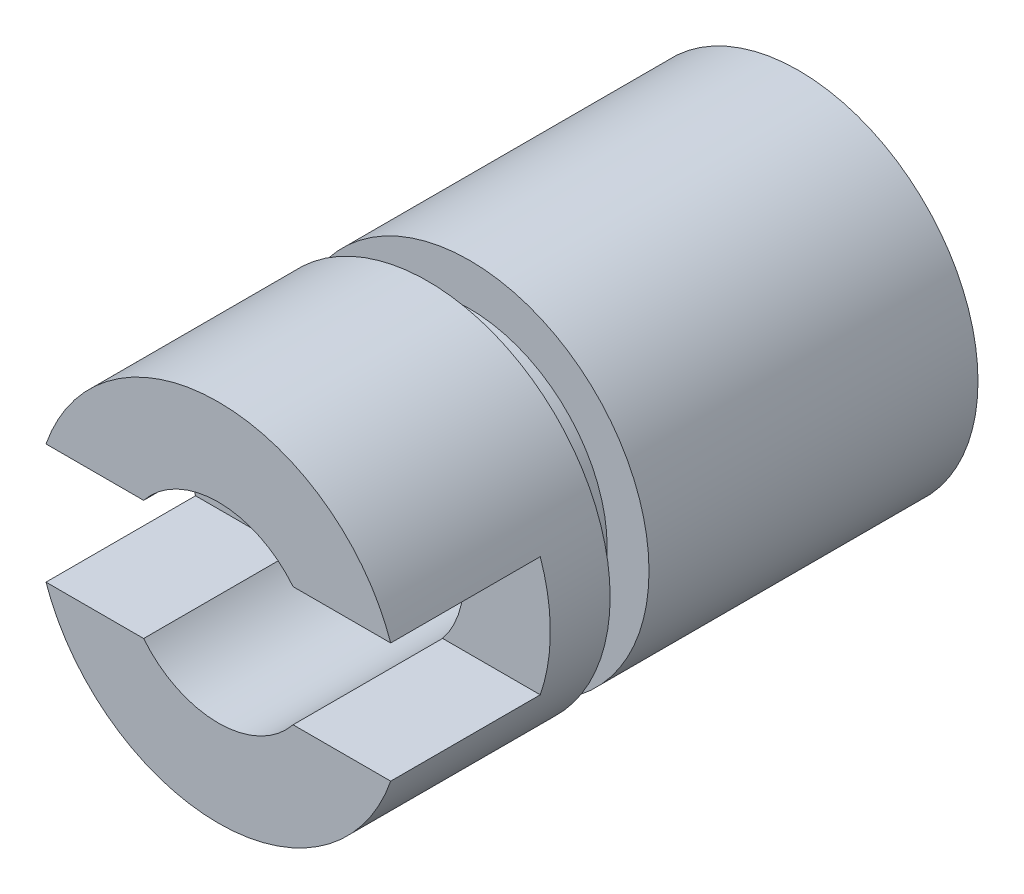
ISO-10303-21;
HEADER;
FILE_DESCRIPTION(('STEP AP214'),'2;1');
FILE_NAME('part.step','',(''),(''),'','','');
FILE_SCHEMA(('AUTOMOTIVE_DESIGN { 1 0 10303 214 1 1 1 1 }'));
ENDSEC;
DATA;
#1=APPLICATION_CONTEXT('core data for automotive mechanical design processes');
#2=APPLICATION_PROTOCOL_DEFINITION('international standard','automotive_design',2000,#1);
#3=PRODUCT_CONTEXT('',#1,'mechanical');
#4=PRODUCT('Part','Part','',(#3));
#5=PRODUCT_RELATED_PRODUCT_CATEGORY('part','',(#4));
#6=PRODUCT_DEFINITION_FORMATION('','',#4);
#7=PRODUCT_DEFINITION_CONTEXT('part definition',#1,'design');
#8=PRODUCT_DEFINITION('design','',#6,#7);
#9=PRODUCT_DEFINITION_SHAPE('','',#8);
#10=(LENGTH_UNIT() NAMED_UNIT(*) SI_UNIT(.MILLI.,.METRE.));
#11=(NAMED_UNIT(*) PLANE_ANGLE_UNIT() SI_UNIT($,.RADIAN.));
#12=(NAMED_UNIT(*) SI_UNIT($,.STERADIAN.) SOLID_ANGLE_UNIT());
#13=UNCERTAINTY_MEASURE_WITH_UNIT(LENGTH_MEASURE(1.E-05),#10,'distance_accuracy_value','');
#14=(GEOMETRIC_REPRESENTATION_CONTEXT(3) GLOBAL_UNCERTAINTY_ASSIGNED_CONTEXT((#13)) GLOBAL_UNIT_ASSIGNED_CONTEXT((#10,
#11,#12)) REPRESENTATION_CONTEXT('',''));
#15=CARTESIAN_POINT('',(0.,0.,0.));
#16=DIRECTION('',(0.,0.,1.));
#17=DIRECTION('',(1.,0.,0.));
#18=AXIS2_PLACEMENT_3D('',#15,#16,#17);
#19=CARTESIAN_POINT('',(0.,0.,9.7));
#20=DIRECTION('',(0.,0.,1.));
#21=DIRECTION('',(1.,0.,0.));
#22=AXIS2_PLACEMENT_3D('',#19,#20,#21);
#23=PLANE('',#22);
#24=DIRECTION('',(-1.,0.,0.));
#25=VECTOR('',#24,1.);
#26=CARTESIAN_POINT('',(0.,1.,9.7));
#27=LINE('',#26,#25);
#28=CARTESIAN_POINT('',(2.88140590684478,1.,9.7));
#29=VERTEX_POINT('',#28);
#30=CARTESIAN_POINT('',(1.24899959967968,1.,9.7));
#31=VERTEX_POINT('',#30);
#32=EDGE_CURVE('E152',#29,#31,#27,.T.);
#33=ORIENTED_EDGE('',*,*,#32,.F.);
#34=CARTESIAN_POINT('',(0.,0.,9.7));
#35=DIRECTION('',(0.,0.,1.));
#36=DIRECTION('',(1.,0.,0.));
#37=AXIS2_PLACEMENT_3D('',#34,#35,#36);
#38=CIRCLE('',#37,3.05);
#39=CARTESIAN_POINT('',(-2.88140590684478,1.,9.7));
#40=VERTEX_POINT('',#39);
#41=EDGE_CURVE('E134',#29,#40,#38,.T.);
#42=ORIENTED_EDGE('',*,*,#41,.T.);
#43=CARTESIAN_POINT('',(-1.24899959967968,1.,9.7));
#44=VERTEX_POINT('',#43);
#45=EDGE_CURVE('E113',#44,#40,#27,.T.);
#46=ORIENTED_EDGE('',*,*,#45,.F.);
#47=CARTESIAN_POINT('',(0.,0.,9.7));
#48=DIRECTION('',(0.,0.,1.));
#49=DIRECTION('',(1.,0.,0.));
#50=AXIS2_PLACEMENT_3D('',#47,#48,#49);
#51=CIRCLE('',#50,1.6);
#52=EDGE_CURVE('E128',#44,#31,#51,.F.);
#53=ORIENTED_EDGE('',*,*,#52,.T.);
#54=EDGE_LOOP('',(#33,#42,#46,#53));
#55=FACE_BOUND('',#54,.T.);
#56=ADVANCED_FACE('F41',(#55),#23,.T.);
#57=CARTESIAN_POINT('',(0.,0.,5.5));
#58=DIRECTION('',(0.,0.,1.));
#59=DIRECTION('',(1.,0.,0.));
#60=AXIS2_PLACEMENT_3D('',#57,#58,#59);
#61=PLANE('',#60);
#62=CARTESIAN_POINT('',(0.,0.,5.5));
#63=DIRECTION('',(0.,0.,1.));
#64=DIRECTION('',(1.,0.,0.));
#65=AXIS2_PLACEMENT_3D('',#62,#63,#64);
#66=CIRCLE('',#65,3.);
#67=CARTESIAN_POINT('',(3.,0.,5.5));
#68=VERTEX_POINT('',#67);
#69=EDGE_CURVE('E148',#68,#68,#66,.T.);
#70=ORIENTED_EDGE('',*,*,#69,.T.);
#71=EDGE_LOOP('',(#70));
#72=FACE_BOUND('',#71,.T.);
#73=CARTESIAN_POINT('',(0.,0.,5.5));
#74=DIRECTION('',(0.,0.,1.));
#75=DIRECTION('',(1.,0.,0.));
#76=AXIS2_PLACEMENT_3D('',#73,#74,#75);
#77=CIRCLE('',#76,2.3);
#78=CARTESIAN_POINT('',(2.3,0.,5.5));
#79=VERTEX_POINT('',#78);
#80=EDGE_CURVE('E127',#79,#79,#77,.T.);
#81=ORIENTED_EDGE('',*,*,#80,.F.);
#82=EDGE_LOOP('',(#81));
#83=FACE_BOUND('',#82,.T.);
#84=ADVANCED_FACE('F209',(#72,#83),#61,.T.);
#85=CARTESIAN_POINT('',(0.,0.,0.));
#86=DIRECTION('',(0.,0.,1.));
#87=DIRECTION('',(1.,0.,0.));
#88=AXIS2_PLACEMENT_3D('',#85,#86,#87);
#89=PLANE('',#88);
#90=CARTESIAN_POINT('',(0.,0.,0.));
#91=DIRECTION('',(0.,0.,1.));
#92=DIRECTION('',(1.,0.,0.));
#93=AXIS2_PLACEMENT_3D('',#90,#91,#92);
#94=CIRCLE('',#93,3.);
#95=CARTESIAN_POINT('',(3.,0.,0.));
#96=VERTEX_POINT('',#95);
#97=EDGE_CURVE('E147',#96,#96,#94,.T.);
#98=ORIENTED_EDGE('',*,*,#97,.F.);
#99=EDGE_LOOP('',(#98));
#100=FACE_BOUND('',#99,.T.);
#101=CARTESIAN_POINT('',(0.,0.,0.));
#102=DIRECTION('',(0.,0.,1.));
#103=DIRECTION('',(1.,0.,0.));
#104=AXIS2_PLACEMENT_3D('',#101,#102,#103);
#105=CIRCLE('',#104,1.6);
#106=CARTESIAN_POINT('',(1.6,0.,0.));
#107=VERTEX_POINT('',#106);
#108=EDGE_CURVE('E143',#107,#107,#105,.T.);
#109=ORIENTED_EDGE('',*,*,#108,.T.);
#110=EDGE_LOOP('',(#109));
#111=FACE_BOUND('',#110,.T.);
#112=ADVANCED_FACE('F214',(#100,#111),#89,.F.);
#113=CARTESIAN_POINT('',(0.,0.,5.5));
#114=DIRECTION('',(0.,0.,-1.));
#115=DIRECTION('',(-1.,0.,0.));
#116=AXIS2_PLACEMENT_3D('',#113,#114,#115);
#117=CYLINDRICAL_SURFACE('',#116,3.);
#118=ORIENTED_EDGE('',*,*,#69,.F.);
#119=EDGE_LOOP('',(#118));
#120=FACE_BOUND('',#119,.T.);
#121=ORIENTED_EDGE('',*,*,#97,.T.);
#122=EDGE_LOOP('',(#121));
#123=FACE_BOUND('',#122,.T.);
#124=ADVANCED_FACE('F43',(#120,#123),#117,.T.);
#125=CARTESIAN_POINT('',(0.,0.,5.5));
#126=DIRECTION('',(0.,0.,-1.));
#127=DIRECTION('',(-1.,0.,0.));
#128=AXIS2_PLACEMENT_3D('',#125,#126,#127);
#129=CYLINDRICAL_SURFACE('',#128,1.6);
#130=DIRECTION('',(0.,0.,-1.));
#131=VECTOR('',#130,1.);
#132=CARTESIAN_POINT('',(-1.24899959967968,1.,5.5));
#133=LINE('',#132,#131);
#134=CARTESIAN_POINT('',(-1.24899959967968,0.999999999999999,7.2));
#135=VERTEX_POINT('',#134);
#136=EDGE_CURVE('E182',#135,#44,#133,.F.);
#137=ORIENTED_EDGE('',*,*,#136,.F.);
#138=CARTESIAN_POINT('',(0.,0.,7.2));
#139=DIRECTION('',(0.,0.,1.));
#140=DIRECTION('',(1.,0.,0.));
#141=AXIS2_PLACEMENT_3D('',#138,#139,#140);
#142=CIRCLE('',#141,1.6);
#143=CARTESIAN_POINT('',(-1.24899959967968,-1.,7.2));
#144=VERTEX_POINT('',#143);
#145=EDGE_CURVE('E123',#135,#144,#142,.T.);
#146=ORIENTED_EDGE('',*,*,#145,.T.);
#147=DIRECTION('',(0.,0.,-1.));
#148=VECTOR('',#147,1.);
#149=CARTESIAN_POINT('',(-1.24899959967968,-1.,5.5));
#150=LINE('',#149,#148);
#151=CARTESIAN_POINT('',(-1.24899959967968,-1.,9.7));
#152=VERTEX_POINT('',#151);
#153=EDGE_CURVE('E107',#152,#144,#150,.T.);
#154=ORIENTED_EDGE('',*,*,#153,.F.);
#155=CARTESIAN_POINT('',(1.24899959967968,-1.,9.7));
#156=VERTEX_POINT('',#155);
#157=EDGE_CURVE('E122',#156,#152,#51,.F.);
#158=ORIENTED_EDGE('',*,*,#157,.F.);
#159=DIRECTION('',(0.,0.,-1.));
#160=VECTOR('',#159,1.);
#161=CARTESIAN_POINT('',(1.24899959967968,-1.,5.5));
#162=LINE('',#161,#160);
#163=CARTESIAN_POINT('',(1.24899959967968,-0.999999999999999,7.2));
#164=VERTEX_POINT('',#163);
#165=EDGE_CURVE('E56',#164,#156,#162,.F.);
#166=ORIENTED_EDGE('',*,*,#165,.F.);
#167=CARTESIAN_POINT('',(1.24899959967968,1.,7.2));
#168=VERTEX_POINT('',#167);
#169=EDGE_CURVE('E187',#164,#168,#142,.T.);
#170=ORIENTED_EDGE('',*,*,#169,.T.);
#171=DIRECTION('',(0.,0.,-1.));
#172=VECTOR('',#171,1.);
#173=CARTESIAN_POINT('',(1.24899959967968,1.,5.5));
#174=LINE('',#173,#172);
#175=EDGE_CURVE('E173',#31,#168,#174,.T.);
#176=ORIENTED_EDGE('',*,*,#175,.F.);
#177=ORIENTED_EDGE('',*,*,#52,.F.);
#178=EDGE_LOOP('',(#137,#146,#154,#158,#166,#170,#176,#177));
#179=FACE_BOUND('',#178,.T.);
#180=ORIENTED_EDGE('',*,*,#108,.F.);
#181=EDGE_LOOP('',(#180));
#182=FACE_BOUND('',#181,.T.);
#183=ADVANCED_FACE('F120',(#179,#182),#129,.F.);
#184=CARTESIAN_POINT('',(0.,0.,6.2));
#185=DIRECTION('',(0.,0.,-1.));
#186=DIRECTION('',(-1.,0.,0.));
#187=AXIS2_PLACEMENT_3D('',#184,#185,#186);
#188=CYLINDRICAL_SURFACE('',#187,2.3);
#189=CARTESIAN_POINT('',(0.,0.,6.2));
#190=DIRECTION('',(0.,0.,1.));
#191=DIRECTION('',(1.,0.,0.));
#192=AXIS2_PLACEMENT_3D('',#189,#190,#191);
#193=CIRCLE('',#192,2.3);
#194=CARTESIAN_POINT('',(2.3,0.,6.2));
#195=VERTEX_POINT('',#194);
#196=EDGE_CURVE('E131',#195,#195,#193,.T.);
#197=ORIENTED_EDGE('',*,*,#196,.F.);
#198=EDGE_LOOP('',(#197));
#199=FACE_BOUND('',#198,.T.);
#200=ORIENTED_EDGE('',*,*,#80,.T.);
#201=EDGE_LOOP('',(#200));
#202=FACE_BOUND('',#201,.T.);
#203=ADVANCED_FACE('F226',(#199,#202),#188,.T.);
#204=CARTESIAN_POINT('',(0.,0.,9.7));
#205=DIRECTION('',(0.,0.,-1.));
#206=DIRECTION('',(-1.,0.,0.));
#207=AXIS2_PLACEMENT_3D('',#204,#205,#206);
#208=CYLINDRICAL_SURFACE('',#207,3.05);
#209=CARTESIAN_POINT('',(0.,0.,7.2));
#210=DIRECTION('',(0.,0.,1.));
#211=DIRECTION('',(1.,0.,0.));
#212=AXIS2_PLACEMENT_3D('',#209,#210,#211);
#213=CIRCLE('',#212,3.05);
#214=CARTESIAN_POINT('',(-2.88140590684478,0.999999999999999,7.2));
#215=VERTEX_POINT('',#214);
#216=CARTESIAN_POINT('',(-2.88140590684478,-1.,7.2));
#217=VERTEX_POINT('',#216);
#218=EDGE_CURVE('E12',#215,#217,#213,.T.);
#219=ORIENTED_EDGE('',*,*,#218,.F.);
#220=DIRECTION('',(0.,0.,-1.));
#221=VECTOR('',#220,1.);
#222=CARTESIAN_POINT('',(-2.88140590684478,1.,9.7));
#223=LINE('',#222,#221);
#224=EDGE_CURVE('E124',#215,#40,#223,.F.);
#225=ORIENTED_EDGE('',*,*,#224,.T.);
#226=ORIENTED_EDGE('',*,*,#41,.F.);
#227=DIRECTION('',(0.,0.,-1.));
#228=VECTOR('',#227,1.);
#229=CARTESIAN_POINT('',(2.88140590684478,1.,9.7));
#230=LINE('',#229,#228);
#231=CARTESIAN_POINT('',(2.88140590684478,1.,7.2));
#232=VERTEX_POINT('',#231);
#233=EDGE_CURVE('E172',#29,#232,#230,.T.);
#234=ORIENTED_EDGE('',*,*,#233,.T.);
#235=CARTESIAN_POINT('',(2.88140590684478,-0.999999999999999,7.2));
#236=VERTEX_POINT('',#235);
#237=EDGE_CURVE('E45',#236,#232,#213,.T.);
#238=ORIENTED_EDGE('',*,*,#237,.F.);
#239=DIRECTION('',(0.,0.,-1.));
#240=VECTOR('',#239,1.);
#241=CARTESIAN_POINT('',(2.88140590684478,-1.,9.7));
#242=LINE('',#241,#240);
#243=CARTESIAN_POINT('',(2.88140590684478,-1.,9.7));
#244=VERTEX_POINT('',#243);
#245=EDGE_CURVE('E174',#236,#244,#242,.F.);
#246=ORIENTED_EDGE('',*,*,#245,.T.);
#247=CARTESIAN_POINT('',(-2.88140590684478,-1.,9.7));
#248=VERTEX_POINT('',#247);
#249=EDGE_CURVE('E141',#248,#244,#38,.T.);
#250=ORIENTED_EDGE('',*,*,#249,.F.);
#251=DIRECTION('',(0.,0.,-1.));
#252=VECTOR('',#251,1.);
#253=CARTESIAN_POINT('',(-2.88140590684478,-1.,9.7));
#254=LINE('',#253,#252);
#255=EDGE_CURVE('E64',#248,#217,#254,.T.);
#256=ORIENTED_EDGE('',*,*,#255,.T.);
#257=EDGE_LOOP('',(#219,#225,#226,#234,#238,#246,#250,#256));
#258=FACE_BOUND('',#257,.T.);
#259=CARTESIAN_POINT('',(0.,0.,6.2));
#260=DIRECTION('',(0.,0.,1.));
#261=DIRECTION('',(1.,0.,0.));
#262=AXIS2_PLACEMENT_3D('',#259,#260,#261);
#263=CIRCLE('',#262,3.05);
#264=CARTESIAN_POINT('',(3.05,0.,6.2));
#265=VERTEX_POINT('',#264);
#266=EDGE_CURVE('E138',#265,#265,#263,.T.);
#267=ORIENTED_EDGE('',*,*,#266,.T.);
#268=EDGE_LOOP('',(#267));
#269=FACE_BOUND('',#268,.T.);
#270=ADVANCED_FACE('F179',(#258,#269),#208,.T.);
#271=DIRECTION('',(1.,0.,0.));
#272=VECTOR('',#271,1.);
#273=CARTESIAN_POINT('',(0.,-1.,9.7));
#274=LINE('',#273,#272);
#275=EDGE_CURVE('E104',#248,#152,#274,.T.);
#276=ORIENTED_EDGE('',*,*,#275,.F.);
#277=ORIENTED_EDGE('',*,*,#249,.T.);
#278=EDGE_CURVE('E114',#156,#244,#274,.T.);
#279=ORIENTED_EDGE('',*,*,#278,.F.);
#280=ORIENTED_EDGE('',*,*,#157,.T.);
#281=EDGE_LOOP('',(#276,#277,#279,#280));
#282=FACE_BOUND('',#281,.T.);
#283=ADVANCED_FACE('F126',(#282),#23,.T.);
#284=CARTESIAN_POINT('',(0.,0.,6.2));
#285=DIRECTION('',(0.,0.,1.));
#286=DIRECTION('',(1.,0.,0.));
#287=AXIS2_PLACEMENT_3D('',#284,#285,#286);
#288=PLANE('',#287);
#289=ORIENTED_EDGE('',*,*,#196,.T.);
#290=EDGE_LOOP('',(#289));
#291=FACE_BOUND('',#290,.T.);
#292=ORIENTED_EDGE('',*,*,#266,.F.);
#293=EDGE_LOOP('',(#292));
#294=FACE_BOUND('',#293,.T.);
#295=ADVANCED_FACE('F220',(#291,#294),#288,.F.);
#296=CARTESIAN_POINT('',(3.1,1.,7.2));
#297=DIRECTION('',(0.,1.,0.));
#298=DIRECTION('',(-1.,0.,0.));
#299=AXIS2_PLACEMENT_3D('',#296,#297,#298);
#300=PLANE('',#299);
#301=ORIENTED_EDGE('',*,*,#175,.T.);
#302=DIRECTION('',(-1.,0.,0.));
#303=VECTOR('',#302,1.);
#304=CARTESIAN_POINT('',(3.1,1.,7.2));
#305=LINE('',#304,#303);
#306=EDGE_CURVE('E165',#232,#168,#305,.T.);
#307=ORIENTED_EDGE('',*,*,#306,.F.);
#308=ORIENTED_EDGE('',*,*,#233,.F.);
#309=ORIENTED_EDGE('',*,*,#32,.T.);
#310=EDGE_LOOP('',(#301,#307,#308,#309));
#311=FACE_BOUND('',#310,.T.);
#312=ADVANCED_FACE('F171',(#311),#300,.F.);
#313=CARTESIAN_POINT('',(3.1,-1.,7.2));
#314=DIRECTION('',(0.,-1.,0.));
#315=DIRECTION('',(1.,0.,0.));
#316=AXIS2_PLACEMENT_3D('',#313,#314,#315);
#317=PLANE('',#316);
#318=ORIENTED_EDGE('',*,*,#165,.T.);
#319=ORIENTED_EDGE('',*,*,#278,.T.);
#320=ORIENTED_EDGE('',*,*,#245,.F.);
#321=DIRECTION('',(1.,0.,0.));
#322=VECTOR('',#321,1.);
#323=CARTESIAN_POINT('',(3.1,-1.,7.2));
#324=LINE('',#323,#322);
#325=EDGE_CURVE('E167',#164,#236,#324,.T.);
#326=ORIENTED_EDGE('',*,*,#325,.F.);
#327=EDGE_LOOP('',(#318,#319,#320,#326));
#328=FACE_BOUND('',#327,.T.);
#329=ADVANCED_FACE('F189',(#328),#317,.F.);
#330=CARTESIAN_POINT('',(0.,0.,7.2));
#331=DIRECTION('',(0.,0.,1.));
#332=DIRECTION('',(1.,0.,0.));
#333=AXIS2_PLACEMENT_3D('',#330,#331,#332);
#334=PLANE('',#333);
#335=ORIENTED_EDGE('',*,*,#325,.T.);
#336=ORIENTED_EDGE('',*,*,#237,.T.);
#337=ORIENTED_EDGE('',*,*,#306,.T.);
#338=ORIENTED_EDGE('',*,*,#169,.F.);
#339=EDGE_LOOP('',(#335,#336,#337,#338));
#340=FACE_BOUND('',#339,.T.);
#341=ADVANCED_FACE('F164',(#340),#334,.T.);
#342=EDGE_CURVE('E175',#135,#215,#305,.T.);
#343=ORIENTED_EDGE('',*,*,#342,.T.);
#344=ORIENTED_EDGE('',*,*,#218,.T.);
#345=EDGE_CURVE('E190',#217,#144,#324,.T.);
#346=ORIENTED_EDGE('',*,*,#345,.T.);
#347=ORIENTED_EDGE('',*,*,#145,.F.);
#348=EDGE_LOOP('',(#343,#344,#346,#347));
#349=FACE_BOUND('',#348,.T.);
#350=ADVANCED_FACE('F200',(#349),#334,.T.);
#351=ORIENTED_EDGE('',*,*,#136,.T.);
#352=ORIENTED_EDGE('',*,*,#45,.T.);
#353=ORIENTED_EDGE('',*,*,#224,.F.);
#354=ORIENTED_EDGE('',*,*,#342,.F.);
#355=EDGE_LOOP('',(#351,#352,#353,#354));
#356=FACE_BOUND('',#355,.T.);
#357=ADVANCED_FACE('F198',(#356),#300,.F.);
#358=ORIENTED_EDGE('',*,*,#153,.T.);
#359=ORIENTED_EDGE('',*,*,#345,.F.);
#360=ORIENTED_EDGE('',*,*,#255,.F.);
#361=ORIENTED_EDGE('',*,*,#275,.T.);
#362=EDGE_LOOP('',(#358,#359,#360,#361));
#363=FACE_BOUND('',#362,.T.);
#364=ADVANCED_FACE('F106',(#363),#317,.F.);
#365=CLOSED_SHELL('',(#56,#84,#112,#124,#183,#203,#270,#283,#295,#312,#329,#341,#350,#357,#364));
#366=MANIFOLD_SOLID_BREP('B2',#365);
#367=ADVANCED_BREP_SHAPE_REPRESENTATION('',(#18,#366),#14);
#368=SHAPE_DEFINITION_REPRESENTATION(#9,#367);
ENDSEC;
END-ISO-10303-21;
